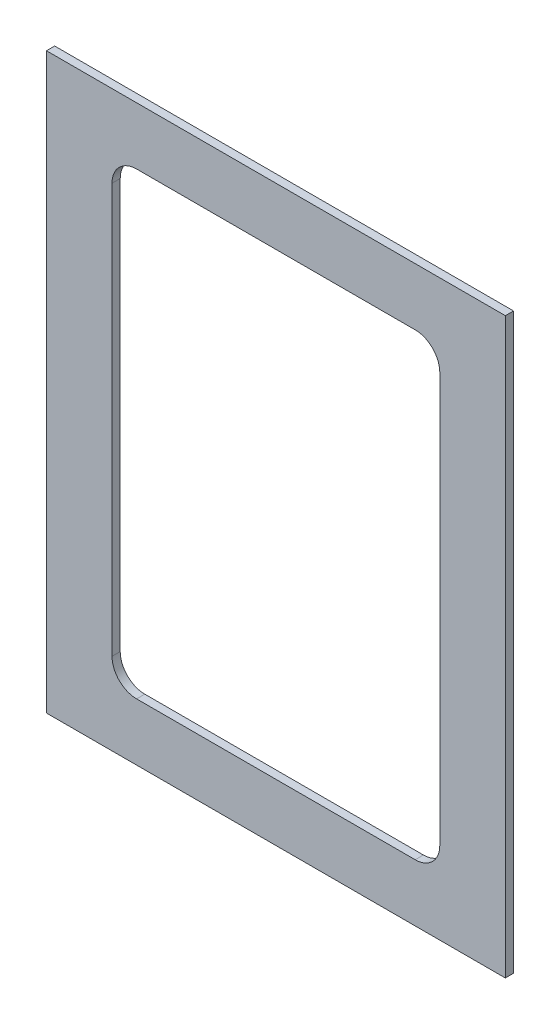
ISO-10303-21;
HEADER;
FILE_DESCRIPTION(('STEP AP214'),'2;1');
FILE_NAME('part.step','',(''),(''),'','','');
FILE_SCHEMA(('AUTOMOTIVE_DESIGN { 1 0 10303 214 1 1 1 1 }'));
ENDSEC;
DATA;
#1=APPLICATION_CONTEXT('core data for automotive mechanical design processes');
#2=APPLICATION_PROTOCOL_DEFINITION('international standard','automotive_design',2000,#1);
#3=PRODUCT_CONTEXT('',#1,'mechanical');
#4=PRODUCT('Part','Part','',(#3));
#5=PRODUCT_RELATED_PRODUCT_CATEGORY('part','',(#4));
#6=PRODUCT_DEFINITION_FORMATION('','',#4);
#7=PRODUCT_DEFINITION_CONTEXT('part definition',#1,'design');
#8=PRODUCT_DEFINITION('design','',#6,#7);
#9=PRODUCT_DEFINITION_SHAPE('','',#8);
#10=(LENGTH_UNIT() NAMED_UNIT(*) SI_UNIT(.MILLI.,.METRE.));
#11=(NAMED_UNIT(*) PLANE_ANGLE_UNIT() SI_UNIT($,.RADIAN.));
#12=(NAMED_UNIT(*) SI_UNIT($,.STERADIAN.) SOLID_ANGLE_UNIT());
#13=UNCERTAINTY_MEASURE_WITH_UNIT(LENGTH_MEASURE(1.E-05),#10,'distance_accuracy_value','');
#14=(GEOMETRIC_REPRESENTATION_CONTEXT(3) GLOBAL_UNCERTAINTY_ASSIGNED_CONTEXT((#13)) GLOBAL_UNIT_ASSIGNED_CONTEXT((#10,
#11,#12)) REPRESENTATION_CONTEXT('',''));
#15=CARTESIAN_POINT('',(0.,0.,0.));
#16=DIRECTION('',(0.,0.,1.));
#17=DIRECTION('',(1.,0.,0.));
#18=AXIS2_PLACEMENT_3D('',#15,#16,#17);
#19=CARTESIAN_POINT('',(-88.9,0.,3.175));
#20=DIRECTION('',(1.,0.,0.));
#21=DIRECTION('',(0.,0.,-1.));
#22=AXIS2_PLACEMENT_3D('',#19,#20,#21);
#23=PLANE('',#22);
#24=DIRECTION('',(0.,-1.,0.));
#25=VECTOR('',#24,1.);
#26=CARTESIAN_POINT('',(-88.9,0.,0.));
#27=LINE('',#26,#25);
#28=CARTESIAN_POINT('',(-88.9,222.25,0.));
#29=VERTEX_POINT('',#28);
#30=CARTESIAN_POINT('',(-88.9,0.,0.));
#31=VERTEX_POINT('',#30);
#32=EDGE_CURVE('E180',#29,#31,#27,.T.);
#33=ORIENTED_EDGE('',*,*,#32,.T.);
#34=DIRECTION('',(0.,0.,-1.));
#35=VECTOR('',#34,1.);
#36=CARTESIAN_POINT('',(-88.9,0.,3.175));
#37=LINE('',#36,#35);
#38=CARTESIAN_POINT('',(-88.9,0.,3.175));
#39=VERTEX_POINT('',#38);
#40=EDGE_CURVE('E11',#39,#31,#37,.T.);
#41=ORIENTED_EDGE('',*,*,#40,.F.);
#42=DIRECTION('',(0.,-1.,0.));
#43=VECTOR('',#42,1.);
#44=CARTESIAN_POINT('',(-88.9,0.,3.175));
#45=LINE('',#44,#43);
#46=CARTESIAN_POINT('',(-88.9,222.25,3.175));
#47=VERTEX_POINT('',#46);
#48=EDGE_CURVE('E192',#47,#39,#45,.T.);
#49=ORIENTED_EDGE('',*,*,#48,.F.);
#50=DIRECTION('',(0.,0.,-1.));
#51=VECTOR('',#50,1.);
#52=CARTESIAN_POINT('',(-88.9,222.25,3.175));
#53=LINE('',#52,#51);
#54=EDGE_CURVE('E202',#47,#29,#53,.T.);
#55=ORIENTED_EDGE('',*,*,#54,.T.);
#56=EDGE_LOOP('',(#33,#41,#49,#55));
#57=FACE_BOUND('',#56,.T.);
#58=ADVANCED_FACE('F35',(#57),#23,.F.);
#59=CARTESIAN_POINT('',(-88.9,0.,3.175));
#60=DIRECTION('',(0.,1.,0.));
#61=DIRECTION('',(-1.,0.,0.));
#62=AXIS2_PLACEMENT_3D('',#59,#60,#61);
#63=PLANE('',#62);
#64=DIRECTION('',(1.,0.,0.));
#65=VECTOR('',#64,1.);
#66=CARTESIAN_POINT('',(-88.9,0.,0.));
#67=LINE('',#66,#65);
#68=CARTESIAN_POINT('',(88.9,0.,0.));
#69=VERTEX_POINT('',#68);
#70=EDGE_CURVE('E205',#31,#69,#67,.T.);
#71=ORIENTED_EDGE('',*,*,#70,.T.);
#72=DIRECTION('',(0.,0.,-1.));
#73=VECTOR('',#72,1.);
#74=CARTESIAN_POINT('',(88.9,0.,3.175));
#75=LINE('',#74,#73);
#76=CARTESIAN_POINT('',(88.9,0.,3.175));
#77=VERTEX_POINT('',#76);
#78=EDGE_CURVE('E42',#77,#69,#75,.T.);
#79=ORIENTED_EDGE('',*,*,#78,.F.);
#80=DIRECTION('',(1.,0.,0.));
#81=VECTOR('',#80,1.);
#82=CARTESIAN_POINT('',(-88.9,0.,3.175));
#83=LINE('',#82,#81);
#84=EDGE_CURVE('E195',#39,#77,#83,.T.);
#85=ORIENTED_EDGE('',*,*,#84,.F.);
#86=ORIENTED_EDGE('',*,*,#40,.T.);
#87=EDGE_LOOP('',(#71,#79,#85,#86));
#88=FACE_BOUND('',#87,.T.);
#89=ADVANCED_FACE('F233',(#88),#63,.F.);
#90=CARTESIAN_POINT('',(88.9,0.,3.175));
#91=DIRECTION('',(-1.,0.,0.));
#92=DIRECTION('',(0.,0.,1.));
#93=AXIS2_PLACEMENT_3D('',#90,#91,#92);
#94=PLANE('',#93);
#95=DIRECTION('',(0.,1.,0.));
#96=VECTOR('',#95,1.);
#97=CARTESIAN_POINT('',(88.9,0.,0.));
#98=LINE('',#97,#96);
#99=CARTESIAN_POINT('',(88.9,222.25,0.));
#100=VERTEX_POINT('',#99);
#101=EDGE_CURVE('E207',#69,#100,#98,.T.);
#102=ORIENTED_EDGE('',*,*,#101,.T.);
#103=DIRECTION('',(0.,0.,-1.));
#104=VECTOR('',#103,1.);
#105=CARTESIAN_POINT('',(88.9,222.25,3.175));
#106=LINE('',#105,#104);
#107=CARTESIAN_POINT('',(88.9,222.25,3.175));
#108=VERTEX_POINT('',#107);
#109=EDGE_CURVE('E212',#108,#100,#106,.T.);
#110=ORIENTED_EDGE('',*,*,#109,.F.);
#111=DIRECTION('',(0.,1.,0.));
#112=VECTOR('',#111,1.);
#113=CARTESIAN_POINT('',(88.9,0.,3.175));
#114=LINE('',#113,#112);
#115=EDGE_CURVE('E198',#77,#108,#114,.T.);
#116=ORIENTED_EDGE('',*,*,#115,.F.);
#117=ORIENTED_EDGE('',*,*,#78,.T.);
#118=EDGE_LOOP('',(#102,#110,#116,#117));
#119=FACE_BOUND('',#118,.T.);
#120=ADVANCED_FACE('F219',(#119),#94,.F.);
#121=CARTESIAN_POINT('',(-88.9,222.25,3.175));
#122=DIRECTION('',(0.,-1.,0.));
#123=DIRECTION('',(0.,0.,-1.));
#124=AXIS2_PLACEMENT_3D('',#121,#122,#123);
#125=PLANE('',#124);
#126=DIRECTION('',(-1.,0.,0.));
#127=VECTOR('',#126,1.);
#128=CARTESIAN_POINT('',(-88.9,222.25,0.));
#129=LINE('',#128,#127);
#130=EDGE_CURVE('E196',#100,#29,#129,.T.);
#131=ORIENTED_EDGE('',*,*,#130,.T.);
#132=ORIENTED_EDGE('',*,*,#54,.F.);
#133=DIRECTION('',(-1.,0.,0.));
#134=VECTOR('',#133,1.);
#135=CARTESIAN_POINT('',(-88.9,222.25,3.175));
#136=LINE('',#135,#134);
#137=EDGE_CURVE('E200',#108,#47,#136,.T.);
#138=ORIENTED_EDGE('',*,*,#137,.F.);
#139=ORIENTED_EDGE('',*,*,#109,.T.);
#140=EDGE_LOOP('',(#131,#132,#138,#139));
#141=FACE_BOUND('',#140,.T.);
#142=ADVANCED_FACE('F226',(#141),#125,.F.);
#143=CARTESIAN_POINT('',(0.,0.,3.175));
#144=DIRECTION('',(0.,0.,-1.));
#145=DIRECTION('',(-1.,0.,0.));
#146=AXIS2_PLACEMENT_3D('',#143,#144,#145);
#147=PLANE('',#146);
#148=DIRECTION('',(-1.,0.,0.));
#149=VECTOR('',#148,1.);
#150=CARTESIAN_POINT('',(53.975,200.025,3.175));
#151=LINE('',#150,#149);
#152=CARTESIAN_POINT('',(53.975,200.025,3.175));
#153=VERTEX_POINT('',#152);
#154=CARTESIAN_POINT('',(-53.975,200.025,3.175));
#155=VERTEX_POINT('',#154);
#156=EDGE_CURVE('E162',#153,#155,#151,.T.);
#157=ORIENTED_EDGE('',*,*,#156,.F.);
#158=CARTESIAN_POINT('',(53.975,190.5,3.175));
#159=DIRECTION('',(0.,0.,1.));
#160=DIRECTION('',(-1.,0.,0.));
#161=AXIS2_PLACEMENT_3D('',#158,#159,#160);
#162=CIRCLE('',#161,9.525);
#163=CARTESIAN_POINT('',(63.5,190.5,3.175));
#164=VERTEX_POINT('',#163);
#165=EDGE_CURVE('E49',#164,#153,#162,.T.);
#166=ORIENTED_EDGE('',*,*,#165,.F.);
#167=DIRECTION('',(0.,1.,0.));
#168=VECTOR('',#167,1.);
#169=CARTESIAN_POINT('',(63.5,31.75,3.175));
#170=LINE('',#169,#168);
#171=CARTESIAN_POINT('',(63.5,31.75,3.175));
#172=VERTEX_POINT('',#171);
#173=EDGE_CURVE('E142',#172,#164,#170,.T.);
#174=ORIENTED_EDGE('',*,*,#173,.F.);
#175=CARTESIAN_POINT('',(53.975,31.75,3.175));
#176=DIRECTION('',(0.,0.,1.));
#177=DIRECTION('',(1.,0.,0.));
#178=AXIS2_PLACEMENT_3D('',#175,#176,#177);
#179=CIRCLE('',#178,9.525);
#180=CARTESIAN_POINT('',(53.975,22.225,3.175));
#181=VERTEX_POINT('',#180);
#182=EDGE_CURVE('E145',#181,#172,#179,.T.);
#183=ORIENTED_EDGE('',*,*,#182,.F.);
#184=DIRECTION('',(1.,0.,0.));
#185=VECTOR('',#184,1.);
#186=CARTESIAN_POINT('',(53.975,22.225,3.175));
#187=LINE('',#186,#185);
#188=CARTESIAN_POINT('',(-53.975,22.225,3.175));
#189=VERTEX_POINT('',#188);
#190=EDGE_CURVE('E173',#189,#181,#187,.T.);
#191=ORIENTED_EDGE('',*,*,#190,.F.);
#192=CARTESIAN_POINT('',(-53.975,31.75,3.175));
#193=DIRECTION('',(0.,0.,1.));
#194=DIRECTION('',(1.,0.,0.));
#195=AXIS2_PLACEMENT_3D('',#192,#193,#194);
#196=CIRCLE('',#195,9.52500000000001);
#197=CARTESIAN_POINT('',(-63.5,31.75,3.175));
#198=VERTEX_POINT('',#197);
#199=EDGE_CURVE('E170',#198,#189,#196,.T.);
#200=ORIENTED_EDGE('',*,*,#199,.F.);
#201=DIRECTION('',(0.,-1.,0.));
#202=VECTOR('',#201,1.);
#203=CARTESIAN_POINT('',(-63.5,31.75,3.175));
#204=LINE('',#203,#202);
#205=CARTESIAN_POINT('',(-63.5,190.5,3.175));
#206=VERTEX_POINT('',#205);
#207=EDGE_CURVE('E167',#206,#198,#204,.T.);
#208=ORIENTED_EDGE('',*,*,#207,.F.);
#209=CARTESIAN_POINT('',(-53.975,190.5,3.175));
#210=DIRECTION('',(0.,0.,1.));
#211=DIRECTION('',(1.,0.,0.));
#212=AXIS2_PLACEMENT_3D('',#209,#210,#211);
#213=CIRCLE('',#212,9.525);
#214=EDGE_CURVE('E164',#155,#206,#213,.T.);
#215=ORIENTED_EDGE('',*,*,#214,.F.);
#216=EDGE_LOOP('',(#157,#166,#174,#183,#191,#200,#208,#215));
#217=FACE_BOUND('',#216,.T.);
#218=ORIENTED_EDGE('',*,*,#48,.T.);
#219=ORIENTED_EDGE('',*,*,#84,.T.);
#220=ORIENTED_EDGE('',*,*,#115,.T.);
#221=ORIENTED_EDGE('',*,*,#137,.T.);
#222=EDGE_LOOP('',(#218,#219,#220,#221));
#223=FACE_BOUND('',#222,.T.);
#224=ADVANCED_FACE('F232',(#217,#223),#147,.F.);
#225=CARTESIAN_POINT('',(0.,0.,0.));
#226=DIRECTION('',(0.,0.,-1.));
#227=DIRECTION('',(-1.,0.,0.));
#228=AXIS2_PLACEMENT_3D('',#225,#226,#227);
#229=PLANE('',#228);
#230=CARTESIAN_POINT('',(53.975,190.5,0.));
#231=DIRECTION('',(0.,0.,1.));
#232=DIRECTION('',(-1.,0.,0.));
#233=AXIS2_PLACEMENT_3D('',#230,#231,#232);
#234=CIRCLE('',#233,9.525);
#235=CARTESIAN_POINT('',(63.5,190.5,0.));
#236=VERTEX_POINT('',#235);
#237=CARTESIAN_POINT('',(53.975,200.025,0.));
#238=VERTEX_POINT('',#237);
#239=EDGE_CURVE('E125',#236,#238,#234,.T.);
#240=ORIENTED_EDGE('',*,*,#239,.T.);
#241=DIRECTION('',(-1.,0.,0.));
#242=VECTOR('',#241,1.);
#243=CARTESIAN_POINT('',(53.975,200.025,0.));
#244=LINE('',#243,#242);
#245=CARTESIAN_POINT('',(-53.975,200.025,0.));
#246=VERTEX_POINT('',#245);
#247=EDGE_CURVE('E134',#238,#246,#244,.T.);
#248=ORIENTED_EDGE('',*,*,#247,.T.);
#249=CARTESIAN_POINT('',(-53.975,190.5,0.));
#250=DIRECTION('',(0.,0.,1.));
#251=DIRECTION('',(1.,0.,0.));
#252=AXIS2_PLACEMENT_3D('',#249,#250,#251);
#253=CIRCLE('',#252,9.525);
#254=CARTESIAN_POINT('',(-63.5,190.5,0.));
#255=VERTEX_POINT('',#254);
#256=EDGE_CURVE('E57',#246,#255,#253,.T.);
#257=ORIENTED_EDGE('',*,*,#256,.T.);
#258=DIRECTION('',(0.,-1.,0.));
#259=VECTOR('',#258,1.);
#260=CARTESIAN_POINT('',(-63.5,31.75,0.));
#261=LINE('',#260,#259);
#262=CARTESIAN_POINT('',(-63.5,31.75,0.));
#263=VERTEX_POINT('',#262);
#264=EDGE_CURVE('E149',#255,#263,#261,.T.);
#265=ORIENTED_EDGE('',*,*,#264,.T.);
#266=CARTESIAN_POINT('',(-53.975,31.75,0.));
#267=DIRECTION('',(0.,0.,1.));
#268=DIRECTION('',(1.,0.,0.));
#269=AXIS2_PLACEMENT_3D('',#266,#267,#268);
#270=CIRCLE('',#269,9.52500000000001);
#271=CARTESIAN_POINT('',(-53.975,22.225,0.));
#272=VERTEX_POINT('',#271);
#273=EDGE_CURVE('E152',#263,#272,#270,.T.);
#274=ORIENTED_EDGE('',*,*,#273,.T.);
#275=DIRECTION('',(1.,0.,0.));
#276=VECTOR('',#275,1.);
#277=CARTESIAN_POINT('',(53.975,22.225,0.));
#278=LINE('',#277,#276);
#279=CARTESIAN_POINT('',(53.975,22.225,0.));
#280=VERTEX_POINT('',#279);
#281=EDGE_CURVE('E155',#272,#280,#278,.T.);
#282=ORIENTED_EDGE('',*,*,#281,.T.);
#283=CARTESIAN_POINT('',(53.975,31.75,0.));
#284=DIRECTION('',(0.,0.,1.));
#285=DIRECTION('',(1.,0.,0.));
#286=AXIS2_PLACEMENT_3D('',#283,#284,#285);
#287=CIRCLE('',#286,9.525);
#288=CARTESIAN_POINT('',(63.5,31.75,0.));
#289=VERTEX_POINT('',#288);
#290=EDGE_CURVE('E158',#280,#289,#287,.T.);
#291=ORIENTED_EDGE('',*,*,#290,.T.);
#292=DIRECTION('',(0.,1.,0.));
#293=VECTOR('',#292,1.);
#294=CARTESIAN_POINT('',(63.5,31.75,0.));
#295=LINE('',#294,#293);
#296=EDGE_CURVE('E131',#289,#236,#295,.T.);
#297=ORIENTED_EDGE('',*,*,#296,.T.);
#298=EDGE_LOOP('',(#240,#248,#257,#265,#274,#282,#291,#297));
#299=FACE_BOUND('',#298,.T.);
#300=ORIENTED_EDGE('',*,*,#32,.F.);
#301=ORIENTED_EDGE('',*,*,#130,.F.);
#302=ORIENTED_EDGE('',*,*,#101,.F.);
#303=ORIENTED_EDGE('',*,*,#70,.F.);
#304=EDGE_LOOP('',(#300,#301,#302,#303));
#305=FACE_BOUND('',#304,.T.);
#306=ADVANCED_FACE('F138',(#299,#305),#229,.T.);
#307=CARTESIAN_POINT('',(53.975,190.5,0.));
#308=DIRECTION('',(0.,0.,1.));
#309=DIRECTION('',(1.,0.,0.));
#310=AXIS2_PLACEMENT_3D('',#307,#308,#309);
#311=CYLINDRICAL_SURFACE('',#310,9.525);
#312=ORIENTED_EDGE('',*,*,#165,.T.);
#313=DIRECTION('',(0.,0.,1.));
#314=VECTOR('',#313,1.);
#315=CARTESIAN_POINT('',(53.975,200.025,0.));
#316=LINE('',#315,#314);
#317=EDGE_CURVE('E121',#238,#153,#316,.T.);
#318=ORIENTED_EDGE('',*,*,#317,.F.);
#319=ORIENTED_EDGE('',*,*,#239,.F.);
#320=DIRECTION('',(0.,0.,1.));
#321=VECTOR('',#320,1.);
#322=CARTESIAN_POINT('',(63.5,190.5,0.));
#323=LINE('',#322,#321);
#324=EDGE_CURVE('E178',#236,#164,#323,.T.);
#325=ORIENTED_EDGE('',*,*,#324,.T.);
#326=EDGE_LOOP('',(#312,#318,#319,#325));
#327=FACE_BOUND('',#326,.T.);
#328=ADVANCED_FACE('F123',(#327),#311,.F.);
#329=CARTESIAN_POINT('',(63.5,31.75,0.));
#330=DIRECTION('',(1.,0.,0.));
#331=DIRECTION('',(0.,0.,-1.));
#332=AXIS2_PLACEMENT_3D('',#329,#330,#331);
#333=PLANE('',#332);
#334=ORIENTED_EDGE('',*,*,#173,.T.);
#335=ORIENTED_EDGE('',*,*,#324,.F.);
#336=ORIENTED_EDGE('',*,*,#296,.F.);
#337=DIRECTION('',(0.,0.,1.));
#338=VECTOR('',#337,1.);
#339=CARTESIAN_POINT('',(63.5,31.75,0.));
#340=LINE('',#339,#338);
#341=EDGE_CURVE('E181',#289,#172,#340,.T.);
#342=ORIENTED_EDGE('',*,*,#341,.T.);
#343=EDGE_LOOP('',(#334,#335,#336,#342));
#344=FACE_BOUND('',#343,.T.);
#345=ADVANCED_FACE('F250',(#344),#333,.F.);
#346=CARTESIAN_POINT('',(53.975,31.75,0.));
#347=DIRECTION('',(0.,0.,1.));
#348=DIRECTION('',(1.,0.,0.));
#349=AXIS2_PLACEMENT_3D('',#346,#347,#348);
#350=CYLINDRICAL_SURFACE('',#349,9.525);
#351=ORIENTED_EDGE('',*,*,#182,.T.);
#352=ORIENTED_EDGE('',*,*,#341,.F.);
#353=ORIENTED_EDGE('',*,*,#290,.F.);
#354=DIRECTION('',(0.,0.,1.));
#355=VECTOR('',#354,1.);
#356=CARTESIAN_POINT('',(53.975,22.225,0.));
#357=LINE('',#356,#355);
#358=EDGE_CURVE('E183',#280,#181,#357,.T.);
#359=ORIENTED_EDGE('',*,*,#358,.T.);
#360=EDGE_LOOP('',(#351,#352,#353,#359));
#361=FACE_BOUND('',#360,.T.);
#362=ADVANCED_FACE('F267',(#361),#350,.F.);
#363=CARTESIAN_POINT('',(53.975,22.225,0.));
#364=DIRECTION('',(0.,-1.,0.));
#365=DIRECTION('',(1.,0.,0.));
#366=AXIS2_PLACEMENT_3D('',#363,#364,#365);
#367=PLANE('',#366);
#368=ORIENTED_EDGE('',*,*,#190,.T.);
#369=ORIENTED_EDGE('',*,*,#358,.F.);
#370=ORIENTED_EDGE('',*,*,#281,.F.);
#371=DIRECTION('',(0.,0.,1.));
#372=VECTOR('',#371,1.);
#373=CARTESIAN_POINT('',(-53.975,22.225,0.));
#374=LINE('',#373,#372);
#375=EDGE_CURVE('E185',#272,#189,#374,.T.);
#376=ORIENTED_EDGE('',*,*,#375,.T.);
#377=EDGE_LOOP('',(#368,#369,#370,#376));
#378=FACE_BOUND('',#377,.T.);
#379=ADVANCED_FACE('F263',(#378),#367,.F.);
#380=CARTESIAN_POINT('',(-53.975,31.75,0.));
#381=DIRECTION('',(0.,0.,1.));
#382=DIRECTION('',(1.,0.,0.));
#383=AXIS2_PLACEMENT_3D('',#380,#381,#382);
#384=CYLINDRICAL_SURFACE('',#383,9.52500000000001);
#385=ORIENTED_EDGE('',*,*,#199,.T.);
#386=ORIENTED_EDGE('',*,*,#375,.F.);
#387=ORIENTED_EDGE('',*,*,#273,.F.);
#388=DIRECTION('',(0.,0.,1.));
#389=VECTOR('',#388,1.);
#390=CARTESIAN_POINT('',(-63.5,31.75,0.));
#391=LINE('',#390,#389);
#392=EDGE_CURVE('E187',#263,#198,#391,.T.);
#393=ORIENTED_EDGE('',*,*,#392,.T.);
#394=EDGE_LOOP('',(#385,#386,#387,#393));
#395=FACE_BOUND('',#394,.T.);
#396=ADVANCED_FACE('F259',(#395),#384,.F.);
#397=CARTESIAN_POINT('',(-63.5,31.75,0.));
#398=DIRECTION('',(-1.,0.,0.));
#399=DIRECTION('',(0.,-1.,0.));
#400=AXIS2_PLACEMENT_3D('',#397,#398,#399);
#401=PLANE('',#400);
#402=ORIENTED_EDGE('',*,*,#207,.T.);
#403=ORIENTED_EDGE('',*,*,#392,.F.);
#404=ORIENTED_EDGE('',*,*,#264,.F.);
#405=DIRECTION('',(0.,0.,1.));
#406=VECTOR('',#405,1.);
#407=CARTESIAN_POINT('',(-63.5,190.5,0.));
#408=LINE('',#407,#406);
#409=EDGE_CURVE('E189',#255,#206,#408,.T.);
#410=ORIENTED_EDGE('',*,*,#409,.T.);
#411=EDGE_LOOP('',(#402,#403,#404,#410));
#412=FACE_BOUND('',#411,.T.);
#413=ADVANCED_FACE('F256',(#412),#401,.F.);
#414=CARTESIAN_POINT('',(-53.975,190.5,0.));
#415=DIRECTION('',(0.,0.,1.));
#416=DIRECTION('',(1.,0.,0.));
#417=AXIS2_PLACEMENT_3D('',#414,#415,#416);
#418=CYLINDRICAL_SURFACE('',#417,9.525);
#419=ORIENTED_EDGE('',*,*,#214,.T.);
#420=ORIENTED_EDGE('',*,*,#409,.F.);
#421=ORIENTED_EDGE('',*,*,#256,.F.);
#422=DIRECTION('',(0.,0.,1.));
#423=VECTOR('',#422,1.);
#424=CARTESIAN_POINT('',(-53.975,200.025,0.));
#425=LINE('',#424,#423);
#426=EDGE_CURVE('E130',#246,#155,#425,.T.);
#427=ORIENTED_EDGE('',*,*,#426,.T.);
#428=EDGE_LOOP('',(#419,#420,#421,#427));
#429=FACE_BOUND('',#428,.T.);
#430=ADVANCED_FACE('F253',(#429),#418,.F.);
#431=CARTESIAN_POINT('',(53.975,200.025,0.));
#432=DIRECTION('',(0.,1.,0.));
#433=DIRECTION('',(0.,0.,1.));
#434=AXIS2_PLACEMENT_3D('',#431,#432,#433);
#435=PLANE('',#434);
#436=ORIENTED_EDGE('',*,*,#156,.T.);
#437=ORIENTED_EDGE('',*,*,#426,.F.);
#438=ORIENTED_EDGE('',*,*,#247,.F.);
#439=ORIENTED_EDGE('',*,*,#317,.T.);
#440=EDGE_LOOP('',(#436,#437,#438,#439));
#441=FACE_BOUND('',#440,.T.);
#442=ADVANCED_FACE('F135',(#441),#435,.F.);
#443=CLOSED_SHELL('',(#58,#89,#120,#142,#224,#306,#328,#345,#362,#379,#396,#413,#430,#442));
#444=MANIFOLD_SOLID_BREP('B2',#443);
#445=ADVANCED_BREP_SHAPE_REPRESENTATION('',(#18,#444),#14);
#446=SHAPE_DEFINITION_REPRESENTATION(#9,#445);
ENDSEC;
END-ISO-10303-21;
